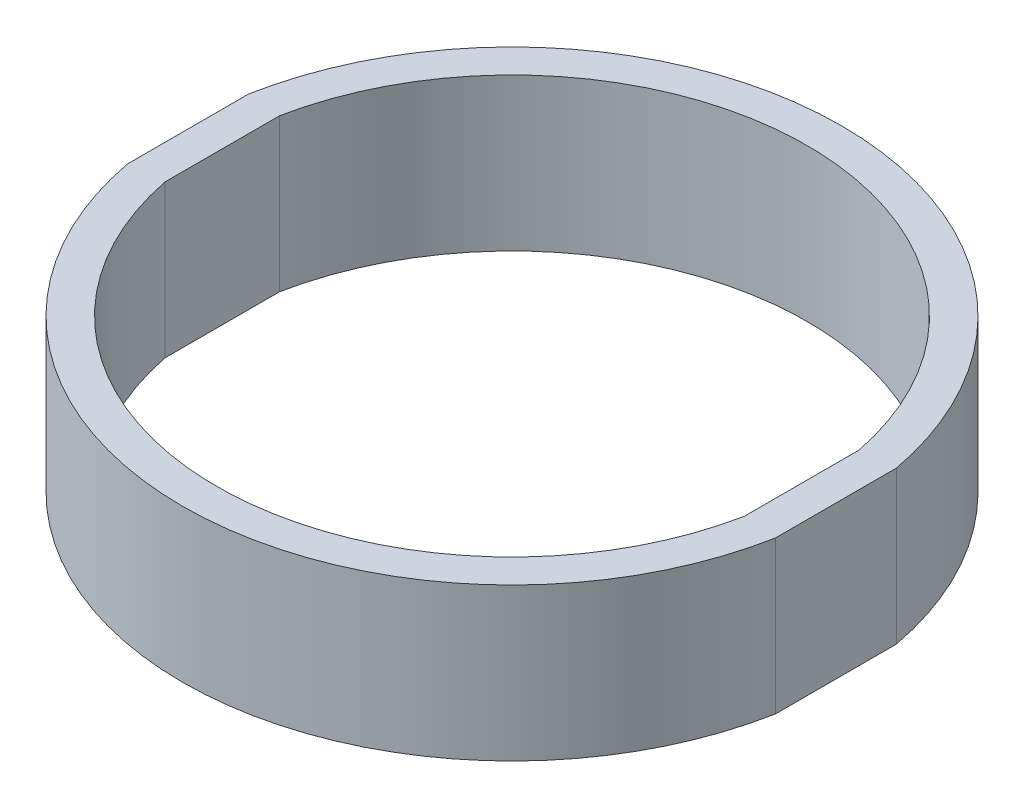
ISO-10303-21;
HEADER;
FILE_DESCRIPTION(('STEP AP214'),'2;1');
FILE_NAME('part.step','',(''),(''),'','','');
FILE_SCHEMA(('AUTOMOTIVE_DESIGN { 1 0 10303 214 1 1 1 1 }'));
ENDSEC;
DATA;
#1=APPLICATION_CONTEXT('core data for automotive mechanical design processes');
#2=APPLICATION_PROTOCOL_DEFINITION('international standard','automotive_design',2000,#1);
#3=PRODUCT_CONTEXT('',#1,'mechanical');
#4=PRODUCT('Part','Part','',(#3));
#5=PRODUCT_RELATED_PRODUCT_CATEGORY('part','',(#4));
#6=PRODUCT_DEFINITION_FORMATION('','',#4);
#7=PRODUCT_DEFINITION_CONTEXT('part definition',#1,'design');
#8=PRODUCT_DEFINITION('design','',#6,#7);
#9=PRODUCT_DEFINITION_SHAPE('','',#8);
#10=(LENGTH_UNIT() NAMED_UNIT(*) SI_UNIT(.MILLI.,.METRE.));
#11=(NAMED_UNIT(*) PLANE_ANGLE_UNIT() SI_UNIT($,.RADIAN.));
#12=(NAMED_UNIT(*) SI_UNIT($,.STERADIAN.) SOLID_ANGLE_UNIT());
#13=UNCERTAINTY_MEASURE_WITH_UNIT(LENGTH_MEASURE(1.E-05),#10,'distance_accuracy_value','');
#14=(GEOMETRIC_REPRESENTATION_CONTEXT(3) GLOBAL_UNCERTAINTY_ASSIGNED_CONTEXT((#13)) GLOBAL_UNIT_ASSIGNED_CONTEXT((#10,
#11,#12)) REPRESENTATION_CONTEXT('',''));
#15=CARTESIAN_POINT('',(0.,0.,0.));
#16=DIRECTION('',(0.,0.,1.));
#17=DIRECTION('',(1.,0.,0.));
#18=AXIS2_PLACEMENT_3D('',#15,#16,#17);
#19=CARTESIAN_POINT('',(0.,10.,0.));
#20=DIRECTION('',(0.,1.,0.));
#21=DIRECTION('',(0.,0.,1.));
#22=AXIS2_PLACEMENT_3D('',#19,#20,#21);
#23=PLANE('',#22);
#24=CARTESIAN_POINT('',(0.,10.,0.));
#25=DIRECTION('',(0.,1.,0.));
#26=DIRECTION('',(0.,0.,1.));
#27=AXIS2_PLACEMENT_3D('',#24,#25,#26);
#28=CIRCLE('',#27,21.6165304068643);
#29=CARTESIAN_POINT('',(21.25,10.,-3.96382225016329));
#30=VERTEX_POINT('',#29);
#31=CARTESIAN_POINT('',(-21.25,10.,-3.96382225016325));
#32=VERTEX_POINT('',#31);
#33=EDGE_CURVE('E139',#30,#32,#28,.T.);
#34=ORIENTED_EDGE('',*,*,#33,.T.);
#35=DIRECTION('',(0.,0.,1.));
#36=VECTOR('',#35,1.);
#37=CARTESIAN_POINT('',(-21.25,10.,-3.96382225016325));
#38=LINE('',#37,#36);
#39=CARTESIAN_POINT('',(-21.25,10.,3.96382225016324));
#40=VERTEX_POINT('',#39);
#41=EDGE_CURVE('E142',#32,#40,#38,.T.);
#42=ORIENTED_EDGE('',*,*,#41,.T.);
#43=CARTESIAN_POINT('',(0.,10.,0.));
#44=DIRECTION('',(0.,1.,0.));
#45=DIRECTION('',(0.,0.,1.));
#46=AXIS2_PLACEMENT_3D('',#43,#44,#45);
#47=CIRCLE('',#46,21.6165304068643);
#48=CARTESIAN_POINT('',(21.25,10.,3.96382225016329));
#49=VERTEX_POINT('',#48);
#50=EDGE_CURVE('E147',#40,#49,#47,.T.);
#51=ORIENTED_EDGE('',*,*,#50,.T.);
#52=DIRECTION('',(0.,0.,-1.));
#53=VECTOR('',#52,1.);
#54=CARTESIAN_POINT('',(21.25,10.,-3.96382225016329));
#55=LINE('',#54,#53);
#56=EDGE_CURVE('E149',#49,#30,#55,.T.);
#57=ORIENTED_EDGE('',*,*,#56,.T.);
#58=EDGE_LOOP('',(#34,#42,#51,#57));
#59=FACE_BOUND('',#58,.T.);
#60=DIRECTION('',(0.,0.,-1.));
#61=VECTOR('',#60,1.);
#62=CARTESIAN_POINT('',(19.,10.,-3.75));
#63=LINE('',#62,#61);
#64=CARTESIAN_POINT('',(19.,10.,3.75));
#65=VERTEX_POINT('',#64);
#66=CARTESIAN_POINT('',(19.,10.,-3.75));
#67=VERTEX_POINT('',#66);
#68=EDGE_CURVE('E115',#65,#67,#63,.T.);
#69=ORIENTED_EDGE('',*,*,#68,.F.);
#70=CARTESIAN_POINT('',(0.,10.,0.));
#71=DIRECTION('',(0.,1.,0.));
#72=DIRECTION('',(0.,0.,1.));
#73=AXIS2_PLACEMENT_3D('',#70,#71,#72);
#74=CIRCLE('',#73,19.3665304068643);
#75=CARTESIAN_POINT('',(-19.,10.,3.75));
#76=VERTEX_POINT('',#75);
#77=EDGE_CURVE('E101',#76,#65,#74,.T.);
#78=ORIENTED_EDGE('',*,*,#77,.F.);
#79=DIRECTION('',(0.,0.,1.));
#80=VECTOR('',#79,1.);
#81=CARTESIAN_POINT('',(-19.,10.,-3.75));
#82=LINE('',#81,#80);
#83=CARTESIAN_POINT('',(-19.,10.,-3.75));
#84=VERTEX_POINT('',#83);
#85=EDGE_CURVE('E128',#84,#76,#82,.T.);
#86=ORIENTED_EDGE('',*,*,#85,.F.);
#87=CARTESIAN_POINT('',(0.,10.,0.));
#88=DIRECTION('',(0.,1.,0.));
#89=DIRECTION('',(0.,0.,1.));
#90=AXIS2_PLACEMENT_3D('',#87,#88,#89);
#91=CIRCLE('',#90,19.3665304068643);
#92=EDGE_CURVE('E125',#67,#84,#91,.T.);
#93=ORIENTED_EDGE('',*,*,#92,.F.);
#94=EDGE_LOOP('',(#69,#78,#86,#93));
#95=FACE_BOUND('',#94,.T.);
#96=ADVANCED_FACE('F39',(#59,#95),#23,.T.);
#97=CARTESIAN_POINT('',(0.,0.,0.));
#98=DIRECTION('',(0.,1.,0.));
#99=DIRECTION('',(0.,0.,1.));
#100=AXIS2_PLACEMENT_3D('',#97,#98,#99);
#101=PLANE('',#100);
#102=CARTESIAN_POINT('',(0.,0.,0.));
#103=DIRECTION('',(0.,1.,0.));
#104=DIRECTION('',(0.,0.,1.));
#105=AXIS2_PLACEMENT_3D('',#102,#103,#104);
#106=CIRCLE('',#105,21.6165304068643);
#107=CARTESIAN_POINT('',(21.25,0.,-3.96382225016329));
#108=VERTEX_POINT('',#107);
#109=CARTESIAN_POINT('',(-21.25,0.,-3.96382225016325));
#110=VERTEX_POINT('',#109);
#111=EDGE_CURVE('E120',#108,#110,#106,.T.);
#112=ORIENTED_EDGE('',*,*,#111,.F.);
#113=DIRECTION('',(0.,0.,-1.));
#114=VECTOR('',#113,1.);
#115=CARTESIAN_POINT('',(21.25,0.,-3.96382225016329));
#116=LINE('',#115,#114);
#117=CARTESIAN_POINT('',(21.25,0.,3.96382225016329));
#118=VERTEX_POINT('',#117);
#119=EDGE_CURVE('E143',#118,#108,#116,.T.);
#120=ORIENTED_EDGE('',*,*,#119,.F.);
#121=CARTESIAN_POINT('',(0.,0.,0.));
#122=DIRECTION('',(0.,1.,0.));
#123=DIRECTION('',(0.,0.,1.));
#124=AXIS2_PLACEMENT_3D('',#121,#122,#123);
#125=CIRCLE('',#124,21.6165304068643);
#126=CARTESIAN_POINT('',(-21.25,0.,3.96382225016324));
#127=VERTEX_POINT('',#126);
#128=EDGE_CURVE('E155',#127,#118,#125,.T.);
#129=ORIENTED_EDGE('',*,*,#128,.F.);
#130=DIRECTION('',(0.,0.,1.));
#131=VECTOR('',#130,1.);
#132=CARTESIAN_POINT('',(-21.25,0.,-3.96382225016325));
#133=LINE('',#132,#131);
#134=EDGE_CURVE('E154',#110,#127,#133,.T.);
#135=ORIENTED_EDGE('',*,*,#134,.F.);
#136=EDGE_LOOP('',(#112,#120,#129,#135));
#137=FACE_BOUND('',#136,.T.);
#138=CARTESIAN_POINT('',(0.,0.,0.));
#139=DIRECTION('',(0.,1.,0.));
#140=DIRECTION('',(0.,0.,1.));
#141=AXIS2_PLACEMENT_3D('',#138,#139,#140);
#142=CIRCLE('',#141,19.3665304068643);
#143=CARTESIAN_POINT('',(-19.,0.,3.75));
#144=VERTEX_POINT('',#143);
#145=CARTESIAN_POINT('',(19.,0.,3.75));
#146=VERTEX_POINT('',#145);
#147=EDGE_CURVE('E62',#144,#146,#142,.T.);
#148=ORIENTED_EDGE('',*,*,#147,.T.);
#149=DIRECTION('',(0.,0.,-1.));
#150=VECTOR('',#149,1.);
#151=CARTESIAN_POINT('',(19.,0.,-3.75));
#152=LINE('',#151,#150);
#153=CARTESIAN_POINT('',(19.,0.,-3.75));
#154=VERTEX_POINT('',#153);
#155=EDGE_CURVE('E118',#146,#154,#152,.T.);
#156=ORIENTED_EDGE('',*,*,#155,.T.);
#157=CARTESIAN_POINT('',(0.,0.,0.));
#158=DIRECTION('',(0.,1.,0.));
#159=DIRECTION('',(0.,0.,1.));
#160=AXIS2_PLACEMENT_3D('',#157,#158,#159);
#161=CIRCLE('',#160,19.3665304068643);
#162=CARTESIAN_POINT('',(-19.,0.,-3.75));
#163=VERTEX_POINT('',#162);
#164=EDGE_CURVE('E135',#154,#163,#161,.T.);
#165=ORIENTED_EDGE('',*,*,#164,.T.);
#166=DIRECTION('',(0.,0.,1.));
#167=VECTOR('',#166,1.);
#168=CARTESIAN_POINT('',(-19.,0.,-3.75));
#169=LINE('',#168,#167);
#170=EDGE_CURVE('E111',#163,#144,#169,.T.);
#171=ORIENTED_EDGE('',*,*,#170,.T.);
#172=EDGE_LOOP('',(#148,#156,#165,#171));
#173=FACE_BOUND('',#172,.T.);
#174=ADVANCED_FACE('F171',(#137,#173),#101,.F.);
#175=CARTESIAN_POINT('',(0.,10.,0.));
#176=DIRECTION('',(0.,-1.,0.));
#177=DIRECTION('',(0.,0.,-1.));
#178=AXIS2_PLACEMENT_3D('',#175,#176,#177);
#179=CYLINDRICAL_SURFACE('',#178,21.6165304068643);
#180=ORIENTED_EDGE('',*,*,#111,.T.);
#181=DIRECTION('',(0.,-1.,0.));
#182=VECTOR('',#181,1.);
#183=CARTESIAN_POINT('',(-21.25,10.,-3.96382225016325));
#184=LINE('',#183,#182);
#185=EDGE_CURVE('E11',#32,#110,#184,.T.);
#186=ORIENTED_EDGE('',*,*,#185,.F.);
#187=ORIENTED_EDGE('',*,*,#33,.F.);
#188=DIRECTION('',(0.,-1.,0.));
#189=VECTOR('',#188,1.);
#190=CARTESIAN_POINT('',(21.25,10.,-3.96382225016329));
#191=LINE('',#190,#189);
#192=EDGE_CURVE('E148',#30,#108,#191,.T.);
#193=ORIENTED_EDGE('',*,*,#192,.T.);
#194=EDGE_LOOP('',(#180,#186,#187,#193));
#195=FACE_BOUND('',#194,.T.);
#196=ADVANCED_FACE('F41',(#195),#179,.T.);
#197=CARTESIAN_POINT('',(-21.25,10.,-3.96382225016325));
#198=DIRECTION('',(1.,0.,0.));
#199=DIRECTION('',(0.,0.,-1.));
#200=AXIS2_PLACEMENT_3D('',#197,#198,#199);
#201=PLANE('',#200);
#202=ORIENTED_EDGE('',*,*,#134,.T.);
#203=DIRECTION('',(0.,-1.,0.));
#204=VECTOR('',#203,1.);
#205=CARTESIAN_POINT('',(-21.25,10.,3.96382225016324));
#206=LINE('',#205,#204);
#207=EDGE_CURVE('E50',#40,#127,#206,.T.);
#208=ORIENTED_EDGE('',*,*,#207,.F.);
#209=ORIENTED_EDGE('',*,*,#41,.F.);
#210=ORIENTED_EDGE('',*,*,#185,.T.);
#211=EDGE_LOOP('',(#202,#208,#209,#210));
#212=FACE_BOUND('',#211,.T.);
#213=ADVANCED_FACE('F183',(#212),#201,.F.);
#214=CARTESIAN_POINT('',(0.,10.,0.));
#215=DIRECTION('',(0.,-1.,0.));
#216=DIRECTION('',(0.,0.,-1.));
#217=AXIS2_PLACEMENT_3D('',#214,#215,#216);
#218=CYLINDRICAL_SURFACE('',#217,21.6165304068643);
#219=ORIENTED_EDGE('',*,*,#128,.T.);
#220=DIRECTION('',(0.,-1.,0.));
#221=VECTOR('',#220,1.);
#222=CARTESIAN_POINT('',(21.25,10.,3.96382225016329));
#223=LINE('',#222,#221);
#224=EDGE_CURVE('E158',#49,#118,#223,.T.);
#225=ORIENTED_EDGE('',*,*,#224,.F.);
#226=ORIENTED_EDGE('',*,*,#50,.F.);
#227=ORIENTED_EDGE('',*,*,#207,.T.);
#228=EDGE_LOOP('',(#219,#225,#226,#227));
#229=FACE_BOUND('',#228,.T.);
#230=ADVANCED_FACE('F167',(#229),#218,.T.);
#231=CARTESIAN_POINT('',(21.25,10.,-3.96382225016329));
#232=DIRECTION('',(-1.,0.,0.));
#233=DIRECTION('',(0.,0.,1.));
#234=AXIS2_PLACEMENT_3D('',#231,#232,#233);
#235=PLANE('',#234);
#236=ORIENTED_EDGE('',*,*,#119,.T.);
#237=ORIENTED_EDGE('',*,*,#192,.F.);
#238=ORIENTED_EDGE('',*,*,#56,.F.);
#239=ORIENTED_EDGE('',*,*,#224,.T.);
#240=EDGE_LOOP('',(#236,#237,#238,#239));
#241=FACE_BOUND('',#240,.T.);
#242=ADVANCED_FACE('F180',(#241),#235,.F.);
#243=CARTESIAN_POINT('',(0.,10.,0.));
#244=DIRECTION('',(0.,-1.,0.));
#245=DIRECTION('',(0.,0.,-1.));
#246=AXIS2_PLACEMENT_3D('',#243,#244,#245);
#247=CYLINDRICAL_SURFACE('',#246,19.3665304068643);
#248=ORIENTED_EDGE('',*,*,#147,.F.);
#249=DIRECTION('',(0.,-1.,0.));
#250=VECTOR('',#249,1.);
#251=CARTESIAN_POINT('',(-19.,10.,3.75));
#252=LINE('',#251,#250);
#253=EDGE_CURVE('E109',#76,#144,#252,.T.);
#254=ORIENTED_EDGE('',*,*,#253,.F.);
#255=ORIENTED_EDGE('',*,*,#77,.T.);
#256=DIRECTION('',(0.,-1.,0.));
#257=VECTOR('',#256,1.);
#258=CARTESIAN_POINT('',(19.,10.,3.75));
#259=LINE('',#258,#257);
#260=EDGE_CURVE('E107',#65,#146,#259,.T.);
#261=ORIENTED_EDGE('',*,*,#260,.T.);
#262=EDGE_LOOP('',(#248,#254,#255,#261));
#263=FACE_BOUND('',#262,.T.);
#264=ADVANCED_FACE('F106',(#263),#247,.F.);
#265=CARTESIAN_POINT('',(19.,10.,-3.75));
#266=DIRECTION('',(-1.,0.,0.));
#267=DIRECTION('',(0.,0.,1.));
#268=AXIS2_PLACEMENT_3D('',#265,#266,#267);
#269=PLANE('',#268);
#270=ORIENTED_EDGE('',*,*,#155,.F.);
#271=ORIENTED_EDGE('',*,*,#260,.F.);
#272=ORIENTED_EDGE('',*,*,#68,.T.);
#273=DIRECTION('',(0.,-1.,0.));
#274=VECTOR('',#273,1.);
#275=CARTESIAN_POINT('',(19.,10.,-3.75));
#276=LINE('',#275,#274);
#277=EDGE_CURVE('E123',#67,#154,#276,.T.);
#278=ORIENTED_EDGE('',*,*,#277,.T.);
#279=EDGE_LOOP('',(#270,#271,#272,#278));
#280=FACE_BOUND('',#279,.T.);
#281=ADVANCED_FACE('F116',(#280),#269,.T.);
#282=CARTESIAN_POINT('',(0.,10.,0.));
#283=DIRECTION('',(0.,-1.,0.));
#284=DIRECTION('',(0.,0.,-1.));
#285=AXIS2_PLACEMENT_3D('',#282,#283,#284);
#286=CYLINDRICAL_SURFACE('',#285,19.3665304068643);
#287=ORIENTED_EDGE('',*,*,#164,.F.);
#288=ORIENTED_EDGE('',*,*,#277,.F.);
#289=ORIENTED_EDGE('',*,*,#92,.T.);
#290=DIRECTION('',(0.,-1.,0.));
#291=VECTOR('',#290,1.);
#292=CARTESIAN_POINT('',(-19.,10.,-3.75));
#293=LINE('',#292,#291);
#294=EDGE_CURVE('E53',#84,#163,#293,.T.);
#295=ORIENTED_EDGE('',*,*,#294,.T.);
#296=EDGE_LOOP('',(#287,#288,#289,#295));
#297=FACE_BOUND('',#296,.T.);
#298=ADVANCED_FACE('F206',(#297),#286,.F.);
#299=CARTESIAN_POINT('',(-19.,10.,-3.75));
#300=DIRECTION('',(1.,0.,0.));
#301=DIRECTION('',(0.,0.,-1.));
#302=AXIS2_PLACEMENT_3D('',#299,#300,#301);
#303=PLANE('',#302);
#304=ORIENTED_EDGE('',*,*,#170,.F.);
#305=ORIENTED_EDGE('',*,*,#294,.F.);
#306=ORIENTED_EDGE('',*,*,#85,.T.);
#307=ORIENTED_EDGE('',*,*,#253,.T.);
#308=EDGE_LOOP('',(#304,#305,#306,#307));
#309=FACE_BOUND('',#308,.T.);
#310=ADVANCED_FACE('F210',(#309),#303,.T.);
#311=CLOSED_SHELL('',(#96,#174,#196,#213,#230,#242,#264,#281,#298,#310));
#312=MANIFOLD_SOLID_BREP('B2',#311);
#313=ADVANCED_BREP_SHAPE_REPRESENTATION('',(#18,#312),#14);
#314=SHAPE_DEFINITION_REPRESENTATION(#9,#313);
ENDSEC;
END-ISO-10303-21;
